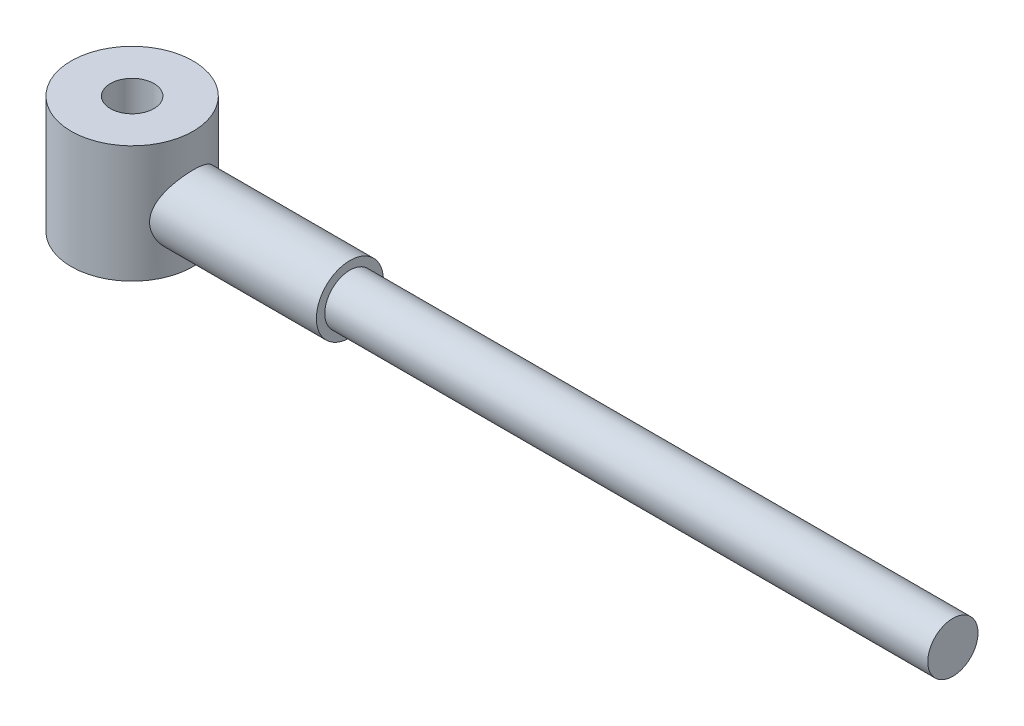
ISO-10303-21;
HEADER;
FILE_DESCRIPTION(('STEP AP214'),'2;1');
FILE_NAME('part.step','',(''),(''),'','','');
FILE_SCHEMA(('AUTOMOTIVE_DESIGN { 1 0 10303 214 1 1 1 1 }'));
ENDSEC;
DATA;
#1=APPLICATION_CONTEXT('core data for automotive mechanical design processes');
#2=APPLICATION_PROTOCOL_DEFINITION('international standard','automotive_design',2000,#1);
#3=PRODUCT_CONTEXT('',#1,'mechanical');
#4=PRODUCT('Part','Part','',(#3));
#5=PRODUCT_RELATED_PRODUCT_CATEGORY('part','',(#4));
#6=PRODUCT_DEFINITION_FORMATION('','',#4);
#7=PRODUCT_DEFINITION_CONTEXT('part definition',#1,'design');
#8=PRODUCT_DEFINITION('design','',#6,#7);
#9=PRODUCT_DEFINITION_SHAPE('','',#8);
#10=(LENGTH_UNIT() NAMED_UNIT(*) SI_UNIT(.MILLI.,.METRE.));
#11=(NAMED_UNIT(*) PLANE_ANGLE_UNIT() SI_UNIT($,.RADIAN.));
#12=(NAMED_UNIT(*) SI_UNIT($,.STERADIAN.) SOLID_ANGLE_UNIT());
#13=UNCERTAINTY_MEASURE_WITH_UNIT(LENGTH_MEASURE(1.E-05),#10,'distance_accuracy_value','');
#14=(GEOMETRIC_REPRESENTATION_CONTEXT(3) GLOBAL_UNCERTAINTY_ASSIGNED_CONTEXT((#13)) GLOBAL_UNIT_ASSIGNED_CONTEXT((#10,
#11,#12)) REPRESENTATION_CONTEXT('',''));
#15=CARTESIAN_POINT('',(0.,0.,0.));
#16=DIRECTION('',(0.,0.,1.));
#17=DIRECTION('',(1.,0.,0.));
#18=AXIS2_PLACEMENT_3D('',#15,#16,#17);
#19=CARTESIAN_POINT('',(0.,0.,0.));
#20=DIRECTION('',(1.,0.,0.));
#21=DIRECTION('',(0.,1.,0.));
#22=AXIS2_PLACEMENT_3D('',#19,#20,#21);
#23=CYLINDRICAL_SURFACE('',#22,10.);
#24=CARTESIAN_POINT('',(-46.8,9.99999999999999,0.));
#25=CARTESIAN_POINT('',(-46.7999976445304,10.0000026664577,-0.259749201461816));
#26=CARTESIAN_POINT('',(-46.8055714424928,9.98987027627847,-0.519467146701257));
#27=CARTESIAN_POINT('',(-46.8277189461475,9.94947695379456,-1.03694926063493));
#28=CARTESIAN_POINT('',(-46.8442959140465,9.91921005202796,-1.29471282696739));
#29=CARTESIAN_POINT('',(-46.8880558936946,9.83888462810039,-1.80652801117559));
#30=CARTESIAN_POINT('',(-46.9152515833443,9.78880244713287,-2.06057481397558));
#31=CARTESIAN_POINT('',(-46.9795646834679,9.66946809285771,-2.56281221205247));
#32=CARTESIAN_POINT('',(-47.0166814689057,9.60021712718723,-2.81100317517979));
#33=CARTESIAN_POINT('',(-47.0997710848369,9.44365268514974,-3.29890874325774));
#34=CARTESIAN_POINT('',(-47.1457063768965,9.35641565902542,-3.53865435320174));
#35=CARTESIAN_POINT('',(-47.2454855362314,9.16457819572049,-4.00937761762963));
#36=CARTESIAN_POINT('',(-47.299329500617,9.05997754533049,-4.24035516440696));
#37=CARTESIAN_POINT('',(-47.4137418923355,8.83436040018634,-4.69231909884569));
#38=CARTESIAN_POINT('',(-47.4743085904093,8.71334812515336,-4.91330803534678));
#39=CARTESIAN_POINT('',(-47.6009435549553,8.45575239614727,-5.34446888294257));
#40=CARTESIAN_POINT('',(-47.6670139960026,8.31916277949387,-5.55463646485197));
#41=CARTESIAN_POINT('',(-47.8079817642267,8.0214612486673,-5.97724539810796));
#42=CARTESIAN_POINT('',(-47.8831737185992,7.85931058739799,-6.18885688055357));
#43=CARTESIAN_POINT('',(-48.0366210841531,7.51925847107143,-6.59783986706639));
#44=CARTESIAN_POINT('',(-48.1148767121055,7.34135590035633,-6.79521036068979));
#45=CARTESIAN_POINT('',(-48.2727552672233,6.97057212799422,-7.1750693845058));
#46=CARTESIAN_POINT('',(-48.3523791966188,6.77767954771595,-7.35754638961537));
#47=CARTESIAN_POINT('',(-48.5111186323906,6.37784309972755,-7.70672338617213));
#48=CARTESIAN_POINT('',(-48.5902340317476,6.17089637391044,-7.87342015188696));
#49=CARTESIAN_POINT('',(-48.7537194777807,5.72270512590638,-8.20585004222555));
#50=CARTESIAN_POINT('',(-48.8378381245203,5.48009099014076,-8.36986638346831));
#51=CARTESIAN_POINT('',(-49.0004424965984,4.98012857869002,-8.67665251602389));
#52=CARTESIAN_POINT('',(-49.0789306055638,4.72278662181022,-8.81943132582329));
#53=CARTESIAN_POINT('',(-49.2275327268639,4.19462704594634,-9.08251643121334));
#54=CARTESIAN_POINT('',(-49.2976495316276,3.92381396348948,-9.20283022808808));
#55=CARTESIAN_POINT('',(-49.4267473269758,3.37024881867773,-9.41964673226206));
#56=CARTESIAN_POINT('',(-49.4857297828861,3.0874983333354,-9.51615257329932));
#57=CARTESIAN_POINT('',(-49.5866316017911,2.53025479365127,-9.67866982155768));
#58=CARTESIAN_POINT('',(-49.6293918855677,2.25636389224279,-9.74621943646107));
#59=CARTESIAN_POINT('',(-49.7009294056116,1.70206914294288,-9.85813742391581));
#60=CARTESIAN_POINT('',(-49.7297073695419,1.42166563477415,-9.90250700280335));
#61=CARTESIAN_POINT('',(-49.7718724453391,0.85728893685567,-9.96722792713234));
#62=CARTESIAN_POINT('',(-49.7852783583605,0.573320538119637,-9.98760861357278));
#63=CARTESIAN_POINT('',(-49.7960801111872,0.00439259477647106,-10.0040458338244));
#64=CARTESIAN_POINT('',(-49.7934781323668,-0.280566809498701,-10.0001056818038));
#65=CARTESIAN_POINT('',(-49.7740195342029,-0.805264579697081,-9.97044328900044));
#66=CARTESIAN_POINT('',(-49.7593912893735,-1.04528856435393,-9.94812533100418));
#67=CARTESIAN_POINT('',(-49.7192710687112,-1.5222104924452,-9.88638874404561));
#68=CARTESIAN_POINT('',(-49.6937789738555,-1.75910840160151,-9.84696992772895));
#69=CARTESIAN_POINT('',(-49.6327916814446,-2.22828019047358,-9.7515180810028));
#70=CARTESIAN_POINT('',(-49.5972933732113,-2.46055260816231,-9.69547988376641));
#71=CARTESIAN_POINT('',(-49.5174273310626,-2.9190828045335,-9.5674254741469));
#72=CARTESIAN_POINT('',(-49.4730590434646,-3.14534020674675,-9.49540826428968));
#73=CARTESIAN_POINT('',(-49.375717942792,-3.59548444517537,-9.33439014974731));
#74=CARTESIAN_POINT('',(-49.3225819621494,-3.81921810072467,-9.24506012310716));
#75=CARTESIAN_POINT('',(-49.2098616757864,-4.25834981421519,-9.0511934989006));
#76=CARTESIAN_POINT('',(-49.1502752454013,-4.47374509373235,-8.9466518869796));
#77=CARTESIAN_POINT('',(-48.964082893575,-5.10616506285507,-8.61131420433978));
#78=CARTESIAN_POINT('',(-48.8299983663132,-5.50962404323545,-8.35873296057125));
#79=CARTESIAN_POINT('',(-48.5317069896457,-6.33527105014842,-7.75660179555172));
#80=CARTESIAN_POINT('',(-48.3660810384588,-6.75040928183944,-7.39804629811283));
#81=CARTESIAN_POINT('',(-48.121716747693,-7.32574186183749,-6.81238704613773));
#82=CARTESIAN_POINT('',(-48.0408752622752,-7.50975746680749,-6.60900634475167));
#83=CARTESIAN_POINT('',(-47.8824470185779,-7.86099281918592,-6.18708820374521));
#84=CARTESIAN_POINT('',(-47.8048590082489,-8.02821906291347,-5.96855668220486));
#85=CARTESIAN_POINT('',(-47.6497396100973,-8.35545709450269,-5.50207974156142));
#86=CARTESIAN_POINT('',(-47.5725625738248,-8.51422841839825,-5.25314456127933));
#87=CARTESIAN_POINT('',(-47.4261626374587,-8.81001000167863,-4.74039150772315));
#88=CARTESIAN_POINT('',(-47.3569402456507,-8.94701887070059,-4.47657268501878));
#89=CARTESIAN_POINT('',(-47.2285206313676,-9.19766578467125,-3.93594292356691));
#90=CARTESIAN_POINT('',(-47.1693159373581,-9.31132126104574,-3.65914186596309));
#91=CARTESIAN_POINT('',(-47.0626941080966,-9.5139039802431,-3.09444196967732));
#92=CARTESIAN_POINT('',(-47.0152752997396,-9.60283473315999,-2.80654471290366));
#93=CARTESIAN_POINT('',(-46.9375483803022,-9.74759054077012,-2.24932589868357));
#94=CARTESIAN_POINT('',(-46.9060588290335,-9.80572580399696,-1.98076796663275));
#95=CARTESIAN_POINT('',(-46.8549096351595,-9.89979135877683,-1.43867546030843));
#96=CARTESIAN_POINT('',(-46.8352492818048,-9.93572298442386,-1.1651411860527));
#97=CARTESIAN_POINT('',(-46.8083339009524,-9.98484537493409,-0.615576721942835));
#98=CARTESIAN_POINT('',(-46.8010722659676,-9.99804825236307,-0.339547940352454));
#99=CARTESIAN_POINT('',(-46.7991487881323,-10.0015494263374,0.212690965974505));
#100=CARTESIAN_POINT('',(-46.8044861333318,-9.99184919888904,0.488901077878266));
#101=CARTESIAN_POINT('',(-46.8264674542402,-9.95175987349973,1.01215777646485));
#102=CARTESIAN_POINT('',(-46.8419565307968,-9.92348338013197,1.25941854960394));
#103=CARTESIAN_POINT('',(-46.8826889781624,-9.8487533029141,1.75034166523517));
#104=CARTESIAN_POINT('',(-46.9079315581582,-9.80230119273764,1.99400429780177));
#105=CARTESIAN_POINT('',(-46.9675925032082,-9.69174307292365,2.47614538380151));
#106=CARTESIAN_POINT('',(-47.0020113252748,-9.62763618400448,2.71462357838957));
#107=CARTESIAN_POINT('',(-47.0792603952803,-9.48244077063338,3.18494918485616));
#108=CARTESIAN_POINT('',(-47.1220910111764,-9.4013515033109,3.41679630616318));
#109=CARTESIAN_POINT('',(-47.2162974483943,-9.22096147931807,3.87768712426903));
#110=CARTESIAN_POINT('',(-47.2678424865672,-9.12129502368847,4.10655309262159));
#111=CARTESIAN_POINT('',(-47.3776868240902,-8.90586775093312,4.55493652143122));
#112=CARTESIAN_POINT('',(-47.4359885133485,-8.79010123611032,4.77445063624879));
#113=CARTESIAN_POINT('',(-47.6192573057134,-8.41999890249258,5.41737845162418));
#114=CARTESIAN_POINT('',(-47.7526446058378,-8.14275517564362,5.82544358922501));
#115=CARTESIAN_POINT('',(-48.0472275746386,-7.49980431787271,6.63703478988239));
#116=CARTESIAN_POINT('',(-48.2098649596132,-7.12767205946023,7.03495195825818));
#117=CARTESIAN_POINT('',(-48.4536053188156,-6.52509535629003,7.58268004940254));
#118=CARTESIAN_POINT('',(-48.5348858882879,-6.31664185568347,7.75719354495606));
#119=CARTESIAN_POINT('',(-48.6953838196829,-5.88562118912826,8.08909234708366));
#120=CARTESIAN_POINT('',(-48.7746008279931,-5.66305162640089,8.24647473256293));
#121=CARTESIAN_POINT('',(-48.9348153960015,-5.18692904138234,8.55466725424914));
#122=CARTESIAN_POINT('',(-49.0154724302865,-4.93231253353395,8.70401474210429));
#123=CARTESIAN_POINT('',(-49.1690787672594,-4.40914252096716,8.98036303894749));
#124=CARTESIAN_POINT('',(-49.2420317418604,-4.1405957475454,9.10737451311823));
#125=CARTESIAN_POINT('',(-49.3773866023847,-3.59121549725667,9.33765449128067));
#126=CARTESIAN_POINT('',(-49.4397981077709,-3.31039351981264,9.44094467309543));
#127=CARTESIAN_POINT('',(-49.5514014468924,-2.73821831034358,9.62248353241242));
#128=CARTESIAN_POINT('',(-49.6005957493915,-2.4468670565706,9.70073688691869));
#129=CARTESIAN_POINT('',(-49.6793370757182,-1.88479873012141,9.8245679485795));
#130=CARTESIAN_POINT('',(-49.710326424778,-1.61481936603394,9.87257788336313));
#131=CARTESIAN_POINT('',(-49.7581913064134,-1.07058740361396,9.94631690130104));
#132=CARTESIAN_POINT('',(-49.7750678852988,-0.79633512360806,9.97204763622286));
#133=CARTESIAN_POINT('',(-49.7939093463258,-0.246328181270648,10.0007552032978));
#134=CARTESIAN_POINT('',(-49.7958850404418,0.0294252464206275,10.0037485335589));
#135=CARTESIAN_POINT('',(-49.7848561802074,0.579922447750468,9.98696669602037));
#136=CARTESIAN_POINT('',(-49.7718528520394,0.854666302185843,9.96719339189702));
#137=CARTESIAN_POINT('',(-49.734241478772,1.36335785308356,9.90947016502565));
#138=CARTESIAN_POINT('',(-49.7114527592551,1.59777087677284,9.87435888319427));
#139=CARTESIAN_POINT('',(-49.6559305850156,2.06244812747934,9.78785861245199));
#140=CARTESIAN_POINT('',(-49.6231939402489,2.29271099852139,9.73646440179841));
#141=CARTESIAN_POINT('',(-49.5488090007635,2.74766623603843,9.61798204687077));
#142=CARTESIAN_POINT('',(-49.5071612608514,2.97235894834118,9.55089487961892));
#143=CARTESIAN_POINT('',(-49.4161593609432,3.41512891643548,9.40167747408289));
#144=CARTESIAN_POINT('',(-49.3668021339742,3.63320349800276,9.31954124675162));
#145=CARTESIAN_POINT('',(-49.2027056795097,4.30215001906021,9.04067986905382));
#146=CARTESIAN_POINT('',(-49.0766878990578,4.74000090226558,8.81870146849954));
#147=CARTESIAN_POINT('',(-48.8084961684438,5.57510467158188,8.31601759493733));
#148=CARTESIAN_POINT('',(-48.6663136555785,5.97233582721146,8.03528092995224));
#149=CARTESIAN_POINT('',(-48.4387359245108,6.56317780355872,7.55004943890621));
#150=CARTESIAN_POINT('',(-48.354647748281,6.77207818511962,7.36325026980266));
#151=CARTESIAN_POINT('',(-48.187282186523,7.17361837249297,6.97263294474722));
#152=CARTESIAN_POINT('',(-48.1040045821457,7.36626268150174,6.76881953334455));
#153=CARTESIAN_POINT('',(-47.9402781641458,7.7344238667013,6.34488573397528));
#154=CARTESIAN_POINT('',(-47.8598318048425,7.9099261060408,6.12475168779765));
#155=CARTESIAN_POINT('',(-47.7038376144432,8.24249983755343,5.66927799402711));
#156=CARTESIAN_POINT('',(-47.628290393585,8.39956903566774,5.4339364594467));
#157=CARTESIAN_POINT('',(-47.481518285735,8.6991288881387,4.94077442149606));
#158=CARTESIAN_POINT('',(-47.4105353699644,8.84092182354861,4.68245661773992));
#159=CARTESIAN_POINT('',(-47.2779363755601,9.10187694545994,4.15247249159907));
#160=CARTESIAN_POINT('',(-47.2163157041358,9.22105023556931,3.88081280139374));
#161=CARTESIAN_POINT('',(-47.1043465660636,9.43518574194975,3.32646543262751));
#162=CARTESIAN_POINT('',(-47.053976563475,9.53019426345958,3.04380006106136));
#163=CARTESIAN_POINT('',(-46.965965301885,9.69490868471769,2.46940378668902));
#164=CARTESIAN_POINT('',(-46.9283173677421,9.76462785494882,2.17767772594885));
#165=CARTESIAN_POINT('',(-46.8655078028372,9.88039955690259,1.57373509443465));
#166=CARTESIAN_POINT('',(-46.8410209120592,9.92517684719066,1.26120195781708));
#167=CARTESIAN_POINT('',(-46.8082685520368,9.98497524816283,0.632430409321355));
#168=CARTESIAN_POINT('',(-46.8000028673072,9.99999675412773,0.316192046720176));
#169=CARTESIAN_POINT('',(-46.8,9.99999999999999,0.));
#170=B_SPLINE_CURVE_WITH_KNOTS('',3,(#24,#25,#26,#27,#28,#29,#30,#31,#32,#33,#34,#35,#36,#37,
#38,#39,#40,#41,#42,#43,#44,#45,#46,#47,#48,#49,#50,#51,#52,#53,#54,#55,#56,#57,#58,#59,#60,#61,
#62,#63,#64,#65,#66,#67,#68,#69,#70,#71,#72,#73,#74,#75,#76,#77,#78,#79,#80,#81,#82,#83,#84,#85,
#86,#87,#88,#89,#90,#91,#92,#93,#94,#95,#96,#97,#98,#99,#100,#101,#102,#103,#104,#105,#106,#107,
#108,#109,#110,#111,#112,#113,#114,#115,#116,#117,#118,#119,#120,#121,#122,#123,#124,#125,#126,
#127,#128,#129,#130,#131,#132,#133,#134,#135,#136,#137,#138,#139,#140,#141,#142,#143,#144,#145,
#146,#147,#148,#149,#150,#151,#152,#153,#154,#155,#156,#157,#158,#159,#160,#161,#162,#163,#164,
#165,#166,#167,#168,#169),.UNSPECIFIED.,.T.,.F.,(4,2,2,2,2,2,2,2,2,2,2,2,2,2,2,2,2,2,2,2,2,2,2,
2,2,2,2,2,2,2,2,2,2,2,2,2,2,2,2,2,2,2,2,2,2,2,2,2,2,2,2,2,2,2,2,2,2,2,2,2,2,2,2,2,2,2,2,2,2,2,2,
2,4),(0.,0.778938258405539,1.55810755871283,2.33820998317022,3.11826327220487,3.89506686199423,
4.67187999092505,5.44849376469206,6.22541585387023,7.05554137930564,7.88572574700568,
8.71654656575491,9.54753685243334,10.4604909971425,11.3730563435749,12.2853164285949,
13.1974563726313,14.0521270208938,14.9067531859261,15.7603329613064,16.6137964230777,
17.3374453443249,18.0611021939575,18.7849842587325,19.5089115238512,20.2482606633383,
20.9878540767132,22.4663943763174,24.1776862378409,25.0347653895658,25.8915116225336,
26.8058452130651,27.7202371951986,28.6339441579801,29.5475213382398,30.3761060156348,
31.2046409031088,32.0327341123371,32.8607739559867,33.6079615889545,34.3550886527191,
35.10225293326,35.8494499042931,36.613304638922,37.3774303874902,38.904816627926,
40.6029793529275,41.4535234012584,42.3042122528506,43.2210495501946,44.1374478728327,
45.0530053779104,45.9683917522917,46.7950392327472,47.6216254207675,48.4476117860624,
49.2735305409353,49.9870930081376,50.7008845384009,51.4146316407937,52.1286634112434,
53.6429726495202,55.1580878109838,56.0350044637165,56.911677393319,57.7890924485455,
58.6666165857146,59.5746843602179,60.4823052199302,61.388173539278,62.2935658179321,
63.2417779883059,64.1899775623866),.UNSPECIFIED.);
#171=CARTESIAN_POINT('',(-46.8,9.99999999999999,0.));
#172=VERTEX_POINT('',#171);
#173=EDGE_CURVE('E10',#172,#172,#170,.T.);
#174=ORIENTED_EDGE('',*,*,#173,.F.);
#175=EDGE_LOOP('',(#174));
#176=FACE_BOUND('',#175,.T.);
#177=CARTESIAN_POINT('',(0.,0.,0.));
#178=DIRECTION('',(1.,0.,0.));
#179=DIRECTION('',(0.,1.,0.));
#180=AXIS2_PLACEMENT_3D('',#177,#178,#179);
#181=CIRCLE('',#180,10.);
#182=CARTESIAN_POINT('',(0.,10.,0.));
#183=VERTEX_POINT('',#182);
#184=EDGE_CURVE('E46',#183,#183,#181,.T.);
#185=ORIENTED_EDGE('',*,*,#184,.F.);
#186=EDGE_LOOP('',(#185));
#187=FACE_BOUND('',#186,.T.);
#188=ADVANCED_FACE('F35',(#176,#187),#23,.T.);
#189=CARTESIAN_POINT('',(0.,7.49999999999999,0.));
#190=DIRECTION('',(1.,0.,0.));
#191=DIRECTION('',(0.,1.,0.));
#192=AXIS2_PLACEMENT_3D('',#189,#190,#191);
#193=PLANE('',#192);
#194=ORIENTED_EDGE('',*,*,#184,.T.);
#195=EDGE_LOOP('',(#194));
#196=FACE_BOUND('',#195,.T.);
#197=CARTESIAN_POINT('',(0.,0.,0.));
#198=DIRECTION('',(1.,0.,0.));
#199=DIRECTION('',(0.,1.,0.));
#200=AXIS2_PLACEMENT_3D('',#197,#198,#199);
#201=CIRCLE('',#200,7.49999999999999);
#202=CARTESIAN_POINT('',(0.,7.49999999999999,0.));
#203=VERTEX_POINT('',#202);
#204=EDGE_CURVE('E50',#203,#203,#201,.T.);
#205=ORIENTED_EDGE('',*,*,#204,.F.);
#206=EDGE_LOOP('',(#205));
#207=FACE_BOUND('',#206,.T.);
#208=ADVANCED_FACE('F97',(#196,#207),#193,.T.);
#209=CARTESIAN_POINT('',(0.,0.,0.));
#210=DIRECTION('',(1.,0.,0.));
#211=DIRECTION('',(0.,1.,0.));
#212=AXIS2_PLACEMENT_3D('',#209,#210,#211);
#213=CYLINDRICAL_SURFACE('',#212,7.49999999999999);
#214=ORIENTED_EDGE('',*,*,#204,.T.);
#215=EDGE_LOOP('',(#214));
#216=FACE_BOUND('',#215,.T.);
#217=CARTESIAN_POINT('',(180.,0.,0.));
#218=DIRECTION('',(1.,0.,0.));
#219=DIRECTION('',(0.,1.,0.));
#220=AXIS2_PLACEMENT_3D('',#217,#218,#219);
#221=CIRCLE('',#220,7.49999999999998);
#222=CARTESIAN_POINT('',(180.,7.5,0.));
#223=VERTEX_POINT('',#222);
#224=EDGE_CURVE('E54',#223,#223,#221,.T.);
#225=ORIENTED_EDGE('',*,*,#224,.F.);
#226=EDGE_LOOP('',(#225));
#227=FACE_BOUND('',#226,.T.);
#228=ADVANCED_FACE('F91',(#216,#227),#213,.T.);
#229=CARTESIAN_POINT('',(180.,0.,0.));
#230=DIRECTION('',(1.,0.,0.));
#231=DIRECTION('',(0.,1.,0.));
#232=AXIS2_PLACEMENT_3D('',#229,#230,#231);
#233=PLANE('',#232);
#234=ORIENTED_EDGE('',*,*,#224,.T.);
#235=EDGE_LOOP('',(#234));
#236=FACE_BOUND('',#235,.T.);
#237=ADVANCED_FACE('F84',(#236),#233,.T.);
#238=CARTESIAN_POINT('',(-65.,-15.,0.));
#239=DIRECTION('',(0.,1.,0.));
#240=DIRECTION('',(0.,0.,1.));
#241=AXIS2_PLACEMENT_3D('',#238,#239,#240);
#242=CYLINDRICAL_SURFACE('',#241,18.2);
#243=ORIENTED_EDGE('',*,*,#173,.T.);
#244=EDGE_LOOP('',(#243));
#245=FACE_BOUND('',#244,.T.);
#246=CARTESIAN_POINT('',(-65.,-15.,0.));
#247=DIRECTION('',(0.,1.,0.));
#248=DIRECTION('',(0.,0.,1.));
#249=AXIS2_PLACEMENT_3D('',#246,#247,#248);
#250=CIRCLE('',#249,18.2);
#251=CARTESIAN_POINT('',(-65.,-15.,18.2));
#252=VERTEX_POINT('',#251);
#253=EDGE_CURVE('E59',#252,#252,#250,.T.);
#254=ORIENTED_EDGE('',*,*,#253,.T.);
#255=EDGE_LOOP('',(#254));
#256=FACE_BOUND('',#255,.T.);
#257=CARTESIAN_POINT('',(-65.,20.,0.));
#258=DIRECTION('',(0.,1.,0.));
#259=DIRECTION('',(0.,0.,1.));
#260=AXIS2_PLACEMENT_3D('',#257,#258,#259);
#261=CIRCLE('',#260,18.2);
#262=CARTESIAN_POINT('',(-65.,20.,18.2));
#263=VERTEX_POINT('',#262);
#264=EDGE_CURVE('E62',#263,#263,#261,.T.);
#265=ORIENTED_EDGE('',*,*,#264,.F.);
#266=EDGE_LOOP('',(#265));
#267=FACE_BOUND('',#266,.T.);
#268=ADVANCED_FACE('F82',(#245,#256,#267),#242,.T.);
#269=CARTESIAN_POINT('',(-65.,-15.,0.));
#270=DIRECTION('',(0.,1.,0.));
#271=DIRECTION('',(0.,0.,1.));
#272=AXIS2_PLACEMENT_3D('',#269,#270,#271);
#273=PLANE('',#272);
#274=CARTESIAN_POINT('',(-65.,-15.,0.));
#275=DIRECTION('',(0.,1.,0.));
#276=DIRECTION('',(0.,0.,1.));
#277=AXIS2_PLACEMENT_3D('',#274,#275,#276);
#278=CIRCLE('',#277,6.5);
#279=CARTESIAN_POINT('',(-65.,-15.,6.5));
#280=VERTEX_POINT('',#279);
#281=EDGE_CURVE('E65',#280,#280,#278,.T.);
#282=ORIENTED_EDGE('',*,*,#281,.T.);
#283=EDGE_LOOP('',(#282));
#284=FACE_BOUND('',#283,.T.);
#285=ORIENTED_EDGE('',*,*,#253,.F.);
#286=EDGE_LOOP('',(#285));
#287=FACE_BOUND('',#286,.T.);
#288=ADVANCED_FACE('F78',(#284,#287),#273,.F.);
#289=CARTESIAN_POINT('',(-65.,20.,0.));
#290=DIRECTION('',(0.,1.,0.));
#291=DIRECTION('',(0.,0.,1.));
#292=AXIS2_PLACEMENT_3D('',#289,#290,#291);
#293=PLANE('',#292);
#294=CARTESIAN_POINT('',(-65.,20.,0.));
#295=DIRECTION('',(0.,1.,0.));
#296=DIRECTION('',(0.,0.,1.));
#297=AXIS2_PLACEMENT_3D('',#294,#295,#296);
#298=CIRCLE('',#297,6.5);
#299=CARTESIAN_POINT('',(-65.,20.,6.5));
#300=VERTEX_POINT('',#299);
#301=EDGE_CURVE('E68',#300,#300,#298,.T.);
#302=ORIENTED_EDGE('',*,*,#301,.F.);
#303=EDGE_LOOP('',(#302));
#304=FACE_BOUND('',#303,.T.);
#305=ORIENTED_EDGE('',*,*,#264,.T.);
#306=EDGE_LOOP('',(#305));
#307=FACE_BOUND('',#306,.T.);
#308=ADVANCED_FACE('F75',(#304,#307),#293,.T.);
#309=CARTESIAN_POINT('',(-65.,-35.,0.));
#310=DIRECTION('',(0.,1.,0.));
#311=DIRECTION('',(0.,0.,1.));
#312=AXIS2_PLACEMENT_3D('',#309,#310,#311);
#313=CYLINDRICAL_SURFACE('',#312,6.5);
#314=ORIENTED_EDGE('',*,*,#301,.T.);
#315=EDGE_LOOP('',(#314));
#316=FACE_BOUND('',#315,.T.);
#317=ORIENTED_EDGE('',*,*,#281,.F.);
#318=EDGE_LOOP('',(#317));
#319=FACE_BOUND('',#318,.T.);
#320=ADVANCED_FACE('F72',(#316,#319),#313,.F.);
#321=CLOSED_SHELL('',(#188,#208,#228,#237,#268,#288,#308,#320));
#322=MANIFOLD_SOLID_BREP('B2',#321);
#323=ADVANCED_BREP_SHAPE_REPRESENTATION('',(#18,#322),#14);
#324=SHAPE_DEFINITION_REPRESENTATION(#9,#323);
ENDSEC;
END-ISO-10303-21;
